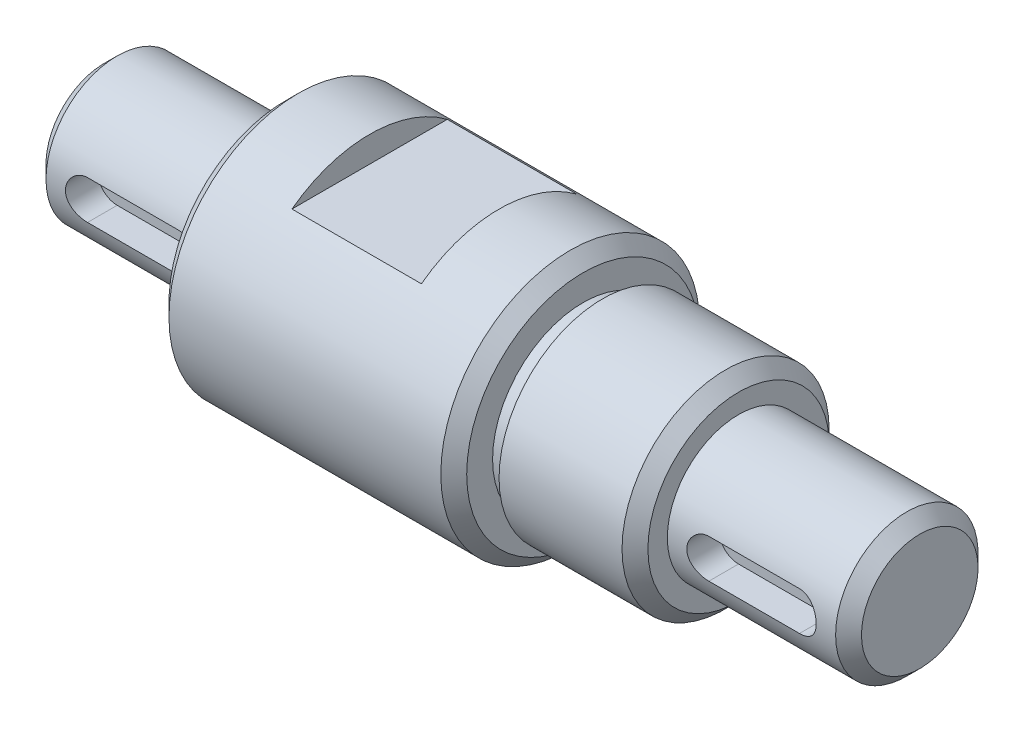
ISO-10303-21;
HEADER;
FILE_DESCRIPTION(('STEP AP214'),'2;1');
FILE_NAME('part.step','',(''),(''),'','','');
FILE_SCHEMA(('AUTOMOTIVE_DESIGN { 1 0 10303 214 1 1 1 1 }'));
ENDSEC;
DATA;
#1=APPLICATION_CONTEXT('core data for automotive mechanical design processes');
#2=APPLICATION_PROTOCOL_DEFINITION('international standard','automotive_design',2000,#1);
#3=PRODUCT_CONTEXT('',#1,'mechanical');
#4=PRODUCT('Part','Part','',(#3));
#5=PRODUCT_RELATED_PRODUCT_CATEGORY('part','',(#4));
#6=PRODUCT_DEFINITION_FORMATION('','',#4);
#7=PRODUCT_DEFINITION_CONTEXT('part definition',#1,'design');
#8=PRODUCT_DEFINITION('design','',#6,#7);
#9=PRODUCT_DEFINITION_SHAPE('','',#8);
#10=(LENGTH_UNIT() NAMED_UNIT(*) SI_UNIT(.MILLI.,.METRE.));
#11=(NAMED_UNIT(*) PLANE_ANGLE_UNIT() SI_UNIT($,.RADIAN.));
#12=(NAMED_UNIT(*) SI_UNIT($,.STERADIAN.) SOLID_ANGLE_UNIT());
#13=UNCERTAINTY_MEASURE_WITH_UNIT(LENGTH_MEASURE(1.E-05),#10,'distance_accuracy_value','');
#14=(GEOMETRIC_REPRESENTATION_CONTEXT(3) GLOBAL_UNCERTAINTY_ASSIGNED_CONTEXT((#13)) GLOBAL_UNIT_ASSIGNED_CONTEXT((#10,
#11,#12)) REPRESENTATION_CONTEXT('',''));
#15=CARTESIAN_POINT('',(0.,0.,0.));
#16=DIRECTION('',(0.,0.,1.));
#17=DIRECTION('',(1.,0.,0.));
#18=AXIS2_PLACEMENT_3D('',#15,#16,#17);
#19=CARTESIAN_POINT('',(0.,0.,0.));
#20=DIRECTION('',(1.,0.,0.));
#21=DIRECTION('',(0.,0.,-1.));
#22=AXIS2_PLACEMENT_3D('',#19,#20,#21);
#23=PLANE('',#22);
#24=CARTESIAN_POINT('',(0.,0.,0.));
#25=DIRECTION('',(1.,0.,0.));
#26=DIRECTION('',(0.,0.,-1.));
#27=AXIS2_PLACEMENT_3D('',#24,#25,#26);
#28=CIRCLE('',#27,8.99999999999999);
#29=CARTESIAN_POINT('',(0.,0.,-8.99999999999999));
#30=VERTEX_POINT('',#29);
#31=EDGE_CURVE('E225',#30,#30,#28,.F.);
#32=ORIENTED_EDGE('',*,*,#31,.T.);
#33=EDGE_LOOP('',(#32));
#34=FACE_BOUND('',#33,.T.);
#35=ADVANCED_FACE('F44',(#34),#23,.F.);
#36=CARTESIAN_POINT('',(0.,0.,0.));
#37=DIRECTION('',(-1.,0.,0.));
#38=DIRECTION('',(0.,0.,1.));
#39=AXIS2_PLACEMENT_3D('',#36,#37,#38);
#40=CYLINDRICAL_SURFACE('',#39,11.);
#41=DIRECTION('',(-1.,0.,0.));
#42=VECTOR('',#41,1.);
#43=CARTESIAN_POINT('',(0.,3.,10.5830052442584));
#44=LINE('',#43,#42);
#45=CARTESIAN_POINT('',(8.,3.,10.5830052442584));
#46=VERTEX_POINT('',#45);
#47=CARTESIAN_POINT('',(22.,3.,10.5830052442584));
#48=VERTEX_POINT('',#47);
#49=EDGE_CURVE('E11',#46,#48,#44,.F.);
#50=ORIENTED_EDGE('',*,*,#49,.T.);
#51=CARTESIAN_POINT('',(22.,3.,10.5830052442584));
#52=CARTESIAN_POINT('',(22.0826938914098,3.00000989976809,10.5829949970026));
#53=CARTESIAN_POINT('',(22.165381704592,2.99658102723595,10.5839742471726));
#54=CARTESIAN_POINT('',(22.3301335662288,2.98292268314841,10.5878356752194));
#55=CARTESIAN_POINT('',(22.4121977316291,2.97269452008914,10.5907174869552));
#56=CARTESIAN_POINT('',(22.5749425121448,2.94554459027321,10.598299618142));
#57=CARTESIAN_POINT('',(22.6556257893863,2.9286377012691,10.6029958951229));
#58=CARTESIAN_POINT('',(22.8152032540543,2.88829120712689,10.6140571066224));
#59=CARTESIAN_POINT('',(22.8940974074084,2.8648514776895,10.6204220728906));
#60=CARTESIAN_POINT('',(23.127242907164,2.78500332821793,10.6417494872311));
#61=CARTESIAN_POINT('',(23.2781393948553,2.71903526586307,10.6589535681767));
#62=CARTESIAN_POINT('',(23.5667053417687,2.56365897700126,10.6973836998985));
#63=CARTESIAN_POINT('',(23.704370097104,2.47424245636572,10.7186111730805));
#64=CARTESIAN_POINT('',(23.9662097059785,2.27200424315806,10.7633148792344));
#65=CARTESIAN_POINT('',(24.0899918782437,2.15868225262837,10.7868322128172));
#66=CARTESIAN_POINT('',(24.3170514389053,1.91292298422355,10.8331129950831));
#67=CARTESIAN_POINT('',(24.4203254772933,1.78048258944453,10.8558763200935));
#68=CARTESIAN_POINT('',(24.6050989067465,1.49749198480952,10.8985459264206));
#69=CARTESIAN_POINT('',(24.686203079821,1.34667477161624,10.9183977479742));
#70=CARTESIAN_POINT('',(24.8217484137797,1.03291980522387,10.9525311229674));
#71=CARTESIAN_POINT('',(24.8761955211319,0.869984764533408,10.9668139185607));
#72=CARTESIAN_POINT('',(24.9556017349027,0.540744675896731,10.9879090070619));
#73=CARTESIAN_POINT('',(24.9812343263694,0.374613167612547,10.9948916417093));
#74=CARTESIAN_POINT('',(25.004404664847,0.0402673813620307,11.0011960589752));
#75=CARTESIAN_POINT('',(25.0019467161783,-0.127946573564687,11.0005190152883));
#76=CARTESIAN_POINT('',(24.9694751241847,-0.456980924404248,10.9917041066205));
#77=CARTESIAN_POINT('',(24.9401899732267,-0.617879308918078,10.9837634920705));
#78=CARTESIAN_POINT('',(24.8560747841412,-0.932383527853136,10.9615477415639));
#79=CARTESIAN_POINT('',(24.8012435083153,-1.08598900853898,10.9472722986892));
#80=CARTESIAN_POINT('',(24.667045133193,-1.38338788045076,10.9137016176963));
#81=CARTESIAN_POINT('',(24.5874317537613,-1.52706425574145,10.8943563157114));
#82=CARTESIAN_POINT('',(24.4061201300935,-1.79926098198643,10.8527253375081));
#83=CARTESIAN_POINT('',(24.3044178271878,-1.92777854091953,10.830439121215));
#84=CARTESIAN_POINT('',(24.0779767649162,-2.17034844112028,10.7844948742978));
#85=CARTESIAN_POINT('',(23.952605446131,-2.2838069302889,10.760815765188));
#86=CARTESIAN_POINT('',(23.6843376191299,-2.48826234185506,10.7153886222241));
#87=CARTESIAN_POINT('',(23.5414362475461,-2.57925300980782,10.6936411271564));
#88=CARTESIAN_POINT('',(23.240805187246,-2.73667910615421,10.6544469945807));
#89=CARTESIAN_POINT('',(23.0829757572429,-2.80293223890785,10.6370325899538));
#90=CARTESIAN_POINT('',(22.7579129054731,-2.9076832432578,10.6088816209578));
#91=CARTESIAN_POINT('',(22.590694057725,-2.94622291362359,10.598135003286));
#92=CARTESIAN_POINT('',(22.3516455601334,-2.98015870664206,10.588613232355));
#93=CARTESIAN_POINT('',(22.2814835402763,-2.98759962141261,10.5865140551644));
#94=CARTESIAN_POINT('',(22.1408924467597,-2.99751512863222,10.58371035186));
#95=CARTESIAN_POINT('',(22.0704639649415,-2.99999749605757,10.5830036423878));
#96=CARTESIAN_POINT('',(22.,-3.,10.5830052442584));
#97=B_SPLINE_CURVE_WITH_KNOTS('',3,(#51,#52,#53,#54,#55,#56,#57,#58,#59,#60,#61,#62,#63,#64,#65,
#66,#67,#68,#69,#70,#71,#72,#73,#74,#75,#76,#77,#78,#79,#80,#81,#82,#83,#84,#85,#86,#87,#88,#89,
#90,#91,#92,#93,#94,#95,#96),.UNSPECIFIED.,.F.,.F.,(4,2,2,2,2,2,2,2,2,2,2,2,2,2,2,2,2,2,2,2,2,2,
4),(0.,0.247994395628692,0.49594107954412,0.743338515979064,0.990740659926203,1.48499724217183,
1.97942888795731,2.48547083856628,2.99159538337128,3.50622794981868,4.02074566333957,
4.52296979924471,5.02511698025348,5.51402000992994,6.00294672920887,6.49689640600088,
6.99093691914144,7.50077286033218,8.01075056671344,8.52441550873707,9.03730408243457,
9.24891043373582,9.46018472611218),.UNSPECIFIED.);
#98=CARTESIAN_POINT('',(22.,-3.,10.5830052442584));
#99=VERTEX_POINT('',#98);
#100=EDGE_CURVE('E557',#48,#99,#97,.T.);
#101=ORIENTED_EDGE('',*,*,#100,.T.);
#102=DIRECTION('',(-1.,0.,0.));
#103=VECTOR('',#102,1.);
#104=CARTESIAN_POINT('',(0.,-3.,10.5830052442584));
#105=LINE('',#104,#103);
#106=CARTESIAN_POINT('',(8.,-3.,10.5830052442584));
#107=VERTEX_POINT('',#106);
#108=EDGE_CURVE('E53',#99,#107,#105,.T.);
#109=ORIENTED_EDGE('',*,*,#108,.T.);
#110=CARTESIAN_POINT('',(8.,-3.,10.5830052442584));
#111=CARTESIAN_POINT('',(7.91730610859018,-3.00000989976809,10.5829949970026));
#112=CARTESIAN_POINT('',(7.83461829540796,-2.99658102723595,10.5839742471726));
#113=CARTESIAN_POINT('',(7.66986643377117,-2.98292268314841,10.5878356752194));
#114=CARTESIAN_POINT('',(7.58780226837092,-2.97269452008914,10.5907174869552));
#115=CARTESIAN_POINT('',(7.42505748785523,-2.94554459027321,10.598299618142));
#116=CARTESIAN_POINT('',(7.34437421061366,-2.9286377012691,10.6029958951229));
#117=CARTESIAN_POINT('',(7.18479674594573,-2.88829120712689,10.6140571066224));
#118=CARTESIAN_POINT('',(7.10590259259161,-2.8648514776895,10.6204220728906));
#119=CARTESIAN_POINT('',(6.87275709283599,-2.78500332821793,10.6417494872311));
#120=CARTESIAN_POINT('',(6.72186060514474,-2.71903526586307,10.6589535681767));
#121=CARTESIAN_POINT('',(6.43329465823131,-2.56365897700125,10.6973836998985));
#122=CARTESIAN_POINT('',(6.29562990289596,-2.47424245636571,10.7186111730805));
#123=CARTESIAN_POINT('',(6.03379029402149,-2.27200424315806,10.7633148792344));
#124=CARTESIAN_POINT('',(5.91000812175632,-2.15868225262836,10.7868322128172));
#125=CARTESIAN_POINT('',(5.68294856109473,-1.91292298422354,10.8331129950831));
#126=CARTESIAN_POINT('',(5.57967452270675,-1.78048258944452,10.8558763200935));
#127=CARTESIAN_POINT('',(5.39490109325355,-1.49749198480951,10.8985459264206));
#128=CARTESIAN_POINT('',(5.31379692017903,-1.34667477161623,10.9183977479742));
#129=CARTESIAN_POINT('',(5.17825158622032,-1.03291980522386,10.9525311229674));
#130=CARTESIAN_POINT('',(5.1238044788681,-0.869984764533403,10.9668139185607));
#131=CARTESIAN_POINT('',(5.0443982650973,-0.540744675896726,10.9879090070619));
#132=CARTESIAN_POINT('',(5.01876567363063,-0.374613167612541,10.9948916417093));
#133=CARTESIAN_POINT('',(4.99559533515301,-0.0402673813620246,11.0011960589752));
#134=CARTESIAN_POINT('',(4.99805328382166,0.127946573564692,11.0005190152883));
#135=CARTESIAN_POINT('',(5.03052487581529,0.456980924404254,10.9917041066205));
#136=CARTESIAN_POINT('',(5.05981002677334,0.617879308918084,10.9837634920705));
#137=CARTESIAN_POINT('',(5.14392521585875,0.932383527853142,10.9615477415639));
#138=CARTESIAN_POINT('',(5.19875649168473,1.08598900853898,10.9472722986892));
#139=CARTESIAN_POINT('',(5.33295486680702,1.38338788045077,10.9137016176963));
#140=CARTESIAN_POINT('',(5.41256824623875,1.52706425574145,10.8943563157114));
#141=CARTESIAN_POINT('',(5.59387986990652,1.79926098198643,10.8527253375081));
#142=CARTESIAN_POINT('',(5.69558217281222,1.92777854091953,10.830439121215));
#143=CARTESIAN_POINT('',(5.92202323508377,2.17034844112028,10.7844948742978));
#144=CARTESIAN_POINT('',(6.04739455386901,2.2838069302889,10.760815765188));
#145=CARTESIAN_POINT('',(6.31566238087013,2.48826234185506,10.7153886222241));
#146=CARTESIAN_POINT('',(6.45856375245395,2.57925300980782,10.6936411271563));
#147=CARTESIAN_POINT('',(6.75919481275404,2.73667910615422,10.6544469945807));
#148=CARTESIAN_POINT('',(6.91702424275707,2.80293223890785,10.6370325899538));
#149=CARTESIAN_POINT('',(7.24208709452695,2.9076832432578,10.6088816209578));
#150=CARTESIAN_POINT('',(7.40930594227505,2.94622291362359,10.598135003286));
#151=CARTESIAN_POINT('',(7.64835443986662,2.98015870664206,10.588613232355));
#152=CARTESIAN_POINT('',(7.71851645972366,2.98759962141261,10.5865140551644));
#153=CARTESIAN_POINT('',(7.85910755324026,2.99751512863222,10.58371035186));
#154=CARTESIAN_POINT('',(7.92953603505847,2.99999749605757,10.5830036423878));
#155=CARTESIAN_POINT('',(8.,3.,10.5830052442584));
#156=B_SPLINE_CURVE_WITH_KNOTS('',3,(#110,#111,#112,#113,#114,#115,#116,#117,#118,#119,#120,
#121,#122,#123,#124,#125,#126,#127,#128,#129,#130,#131,#132,#133,#134,#135,#136,#137,#138,#139,
#140,#141,#142,#143,#144,#145,#146,#147,#148,#149,#150,#151,#152,#153,#154,#155),.UNSPECIFIED.,
.F.,.F.,(4,2,2,2,2,2,2,2,2,2,2,2,2,2,2,2,2,2,2,2,2,2,4),(0.,0.247994395628695,0.495941079544124,
0.743338515979066,0.990740659926206,1.48499724217183,1.97942888795731,2.48547083856629,
2.99159538337129,3.50622794981869,4.02074566333957,4.52296979924472,5.02511698025349,
5.51402000992994,6.00294672920887,6.49689640600088,6.99093691914145,7.50077286033219,
8.01075056671345,8.52441550873707,9.03730408243458,9.24891043373582,9.46018472611218),.UNSPECIFIED.);
#157=EDGE_CURVE('E64',#107,#46,#156,.T.);
#158=ORIENTED_EDGE('',*,*,#157,.T.);
#159=EDGE_LOOP('',(#50,#101,#109,#158));
#160=FACE_BOUND('',#159,.T.);
#161=CARTESIAN_POINT('',(2.00000000000003,0.,0.));
#162=DIRECTION('',(1.,0.,0.));
#163=DIRECTION('',(0.,0.,-1.));
#164=AXIS2_PLACEMENT_3D('',#161,#162,#163);
#165=CIRCLE('',#164,11.);
#166=CARTESIAN_POINT('',(2.00000000000003,0.,-11.));
#167=VERTEX_POINT('',#166);
#168=EDGE_CURVE('E223',#167,#167,#165,.T.);
#169=ORIENTED_EDGE('',*,*,#168,.T.);
#170=EDGE_LOOP('',(#169));
#171=FACE_BOUND('',#170,.T.);
#172=CARTESIAN_POINT('',(28.,0.,0.));
#173=DIRECTION('',(-1.,0.,0.));
#174=DIRECTION('',(0.,0.,1.));
#175=AXIS2_PLACEMENT_3D('',#172,#173,#174);
#176=CIRCLE('',#175,11.);
#177=CARTESIAN_POINT('',(28.,0.,11.));
#178=VERTEX_POINT('',#177);
#179=EDGE_CURVE('E195',#178,#178,#176,.T.);
#180=ORIENTED_EDGE('',*,*,#179,.T.);
#181=EDGE_LOOP('',(#180));
#182=FACE_BOUND('',#181,.T.);
#183=ADVANCED_FACE('F301',(#160,#171,#182),#40,.T.);
#184=CARTESIAN_POINT('',(28.,11.,0.));
#185=DIRECTION('',(1.,0.,0.));
#186=DIRECTION('',(0.,0.,-1.));
#187=AXIS2_PLACEMENT_3D('',#184,#185,#186);
#188=PLANE('',#187);
#189=CARTESIAN_POINT('',(28.,0.,0.));
#190=DIRECTION('',(1.,0.,0.));
#191=DIRECTION('',(0.,0.,-1.));
#192=AXIS2_PLACEMENT_3D('',#189,#190,#191);
#193=CIRCLE('',#192,18.);
#194=CARTESIAN_POINT('',(28.,0.,-18.));
#195=VERTEX_POINT('',#194);
#196=EDGE_CURVE('E218',#195,#195,#193,.F.);
#197=ORIENTED_EDGE('',*,*,#196,.T.);
#198=EDGE_LOOP('',(#197));
#199=FACE_BOUND('',#198,.T.);
#200=ORIENTED_EDGE('',*,*,#179,.F.);
#201=EDGE_LOOP('',(#200));
#202=FACE_BOUND('',#201,.T.);
#203=ADVANCED_FACE('F310',(#199,#202),#188,.F.);
#204=CARTESIAN_POINT('',(0.,0.,0.));
#205=DIRECTION('',(-1.,0.,0.));
#206=DIRECTION('',(0.,0.,1.));
#207=AXIS2_PLACEMENT_3D('',#204,#205,#206);
#208=CYLINDRICAL_SURFACE('',#207,20.);
#209=CARTESIAN_POINT('',(61.,0.,0.));
#210=DIRECTION('',(1.,0.,0.));
#211=DIRECTION('',(0.,0.,-1.));
#212=AXIS2_PLACEMENT_3D('',#209,#210,#211);
#213=CIRCLE('',#212,20.);
#214=CARTESIAN_POINT('',(61.,16.,-12.));
#215=VERTEX_POINT('',#214);
#216=CARTESIAN_POINT('',(61.,16.,12.));
#217=VERTEX_POINT('',#216);
#218=EDGE_CURVE('E231',#215,#217,#213,.T.);
#219=ORIENTED_EDGE('',*,*,#218,.T.);
#220=DIRECTION('',(-1.,0.,0.));
#221=VECTOR('',#220,1.);
#222=CARTESIAN_POINT('',(0.,16.,12.));
#223=LINE('',#222,#221);
#224=CARTESIAN_POINT('',(41.,16.,12.));
#225=VERTEX_POINT('',#224);
#226=EDGE_CURVE('E240',#217,#225,#223,.T.);
#227=ORIENTED_EDGE('',*,*,#226,.T.);
#228=CARTESIAN_POINT('',(41.,0.,0.));
#229=DIRECTION('',(-1.,0.,0.));
#230=DIRECTION('',(0.,0.,1.));
#231=AXIS2_PLACEMENT_3D('',#228,#229,#230);
#232=CIRCLE('',#231,20.);
#233=CARTESIAN_POINT('',(41.,16.,-12.));
#234=VERTEX_POINT('',#233);
#235=EDGE_CURVE('E233',#225,#234,#232,.T.);
#236=ORIENTED_EDGE('',*,*,#235,.T.);
#237=DIRECTION('',(-1.,0.,0.));
#238=VECTOR('',#237,1.);
#239=CARTESIAN_POINT('',(0.,16.,-12.));
#240=LINE('',#239,#238);
#241=EDGE_CURVE('E230',#234,#215,#240,.F.);
#242=ORIENTED_EDGE('',*,*,#241,.T.);
#243=EDGE_LOOP('',(#219,#227,#236,#242));
#244=FACE_BOUND('',#243,.T.);
#245=CARTESIAN_POINT('',(72.,0.,0.));
#246=DIRECTION('',(-1.,0.,0.));
#247=DIRECTION('',(0.,0.,1.));
#248=AXIS2_PLACEMENT_3D('',#245,#246,#247);
#249=CIRCLE('',#248,20.);
#250=CARTESIAN_POINT('',(72.,0.,20.));
#251=VERTEX_POINT('',#250);
#252=EDGE_CURVE('E213',#251,#251,#249,.T.);
#253=ORIENTED_EDGE('',*,*,#252,.T.);
#254=EDGE_LOOP('',(#253));
#255=FACE_BOUND('',#254,.T.);
#256=CARTESIAN_POINT('',(30.,0.,0.));
#257=DIRECTION('',(1.,0.,0.));
#258=DIRECTION('',(0.,0.,-1.));
#259=AXIS2_PLACEMENT_3D('',#256,#257,#258);
#260=CIRCLE('',#259,20.);
#261=CARTESIAN_POINT('',(30.,0.,-20.));
#262=VERTEX_POINT('',#261);
#263=EDGE_CURVE('E209',#262,#262,#260,.T.);
#264=ORIENTED_EDGE('',*,*,#263,.T.);
#265=EDGE_LOOP('',(#264));
#266=FACE_BOUND('',#265,.T.);
#267=ADVANCED_FACE('F345',(#244,#255,#266),#208,.T.);
#268=CARTESIAN_POINT('',(74.,20.,0.));
#269=DIRECTION('',(-1.,0.,0.));
#270=DIRECTION('',(0.,0.,1.));
#271=AXIS2_PLACEMENT_3D('',#268,#269,#270);
#272=PLANE('',#271);
#273=CARTESIAN_POINT('',(74.,0.,0.));
#274=DIRECTION('',(-1.,0.,0.));
#275=DIRECTION('',(0.,0.,1.));
#276=AXIS2_PLACEMENT_3D('',#273,#274,#275);
#277=CIRCLE('',#276,18.);
#278=CARTESIAN_POINT('',(74.,0.,18.));
#279=VERTEX_POINT('',#278);
#280=EDGE_CURVE('E216',#279,#279,#277,.F.);
#281=ORIENTED_EDGE('',*,*,#280,.T.);
#282=EDGE_LOOP('',(#281));
#283=FACE_BOUND('',#282,.T.);
#284=CARTESIAN_POINT('',(74.,0.,0.));
#285=DIRECTION('',(-1.,0.,0.));
#286=DIRECTION('',(0.,0.,1.));
#287=AXIS2_PLACEMENT_3D('',#284,#285,#286);
#288=CIRCLE('',#287,14.);
#289=CARTESIAN_POINT('',(74.,0.,14.));
#290=VERTEX_POINT('',#289);
#291=EDGE_CURVE('E192',#290,#290,#288,.T.);
#292=ORIENTED_EDGE('',*,*,#291,.T.);
#293=EDGE_LOOP('',(#292));
#294=FACE_BOUND('',#293,.T.);
#295=ADVANCED_FACE('F351',(#283,#294),#272,.F.);
#296=CARTESIAN_POINT('',(0.,0.,0.));
#297=DIRECTION('',(-1.,0.,0.));
#298=DIRECTION('',(0.,0.,1.));
#299=AXIS2_PLACEMENT_3D('',#296,#297,#298);
#300=CYLINDRICAL_SURFACE('',#299,14.);
#301=ORIENTED_EDGE('',*,*,#291,.F.);
#302=EDGE_LOOP('',(#301));
#303=FACE_BOUND('',#302,.T.);
#304=CARTESIAN_POINT('',(77.,0.,0.));
#305=DIRECTION('',(-1.,0.,0.));
#306=DIRECTION('',(0.,0.,1.));
#307=AXIS2_PLACEMENT_3D('',#304,#305,#306);
#308=CIRCLE('',#307,14.);
#309=CARTESIAN_POINT('',(77.,0.,14.));
#310=VERTEX_POINT('',#309);
#311=EDGE_CURVE('E188',#310,#310,#308,.T.);
#312=ORIENTED_EDGE('',*,*,#311,.T.);
#313=EDGE_LOOP('',(#312));
#314=FACE_BOUND('',#313,.T.);
#315=ADVANCED_FACE('F357',(#303,#314),#300,.T.);
#316=CARTESIAN_POINT('',(77.,14.,0.));
#317=DIRECTION('',(1.,0.,0.));
#318=DIRECTION('',(0.,0.,-1.));
#319=AXIS2_PLACEMENT_3D('',#316,#317,#318);
#320=PLANE('',#319);
#321=ORIENTED_EDGE('',*,*,#311,.F.);
#322=EDGE_LOOP('',(#321));
#323=FACE_BOUND('',#322,.T.);
#324=CARTESIAN_POINT('',(77.,0.,0.));
#325=DIRECTION('',(-1.,0.,0.));
#326=DIRECTION('',(0.,0.,1.));
#327=AXIS2_PLACEMENT_3D('',#324,#325,#326);
#328=CIRCLE('',#327,16.);
#329=CARTESIAN_POINT('',(77.,0.,16.));
#330=VERTEX_POINT('',#329);
#331=EDGE_CURVE('E189',#330,#330,#328,.T.);
#332=ORIENTED_EDGE('',*,*,#331,.T.);
#333=EDGE_LOOP('',(#332));
#334=FACE_BOUND('',#333,.T.);
#335=ADVANCED_FACE('F363',(#323,#334),#320,.F.);
#336=CARTESIAN_POINT('',(0.,0.,0.));
#337=DIRECTION('',(-1.,0.,0.));
#338=DIRECTION('',(0.,0.,1.));
#339=AXIS2_PLACEMENT_3D('',#336,#337,#338);
#340=CYLINDRICAL_SURFACE('',#339,16.);
#341=CARTESIAN_POINT('',(96.,0.,0.));
#342=DIRECTION('',(-1.,0.,0.));
#343=DIRECTION('',(0.,0.,1.));
#344=AXIS2_PLACEMENT_3D('',#341,#342,#343);
#345=CIRCLE('',#344,16.);
#346=CARTESIAN_POINT('',(96.,0.,16.));
#347=VERTEX_POINT('',#346);
#348=EDGE_CURVE('E204',#347,#347,#345,.T.);
#349=ORIENTED_EDGE('',*,*,#348,.T.);
#350=EDGE_LOOP('',(#349));
#351=FACE_BOUND('',#350,.T.);
#352=ORIENTED_EDGE('',*,*,#331,.F.);
#353=EDGE_LOOP('',(#352));
#354=FACE_BOUND('',#353,.T.);
#355=ADVANCED_FACE('F365',(#351,#354),#340,.T.);
#356=CARTESIAN_POINT('',(98.,16.,0.));
#357=DIRECTION('',(-1.,0.,0.));
#358=DIRECTION('',(0.,0.,1.));
#359=AXIS2_PLACEMENT_3D('',#356,#357,#358);
#360=PLANE('',#359);
#361=CARTESIAN_POINT('',(98.,0.,0.));
#362=DIRECTION('',(-1.,0.,0.));
#363=DIRECTION('',(0.,0.,1.));
#364=AXIS2_PLACEMENT_3D('',#361,#362,#363);
#365=CIRCLE('',#364,14.);
#366=CARTESIAN_POINT('',(98.,0.,14.));
#367=VERTEX_POINT('',#366);
#368=EDGE_CURVE('E210',#367,#367,#365,.F.);
#369=ORIENTED_EDGE('',*,*,#368,.T.);
#370=EDGE_LOOP('',(#369));
#371=FACE_BOUND('',#370,.T.);
#372=CARTESIAN_POINT('',(98.,0.,0.));
#373=DIRECTION('',(-1.,0.,0.));
#374=DIRECTION('',(0.,0.,1.));
#375=AXIS2_PLACEMENT_3D('',#372,#373,#374);
#376=CIRCLE('',#375,11.);
#377=CARTESIAN_POINT('',(98.,0.,11.));
#378=VERTEX_POINT('',#377);
#379=EDGE_CURVE('E182',#378,#378,#376,.T.);
#380=ORIENTED_EDGE('',*,*,#379,.T.);
#381=EDGE_LOOP('',(#380));
#382=FACE_BOUND('',#381,.T.);
#383=ADVANCED_FACE('F300',(#371,#382),#360,.F.);
#384=CARTESIAN_POINT('',(0.,0.,0.));
#385=DIRECTION('',(-1.,0.,0.));
#386=DIRECTION('',(0.,0.,1.));
#387=AXIS2_PLACEMENT_3D('',#384,#385,#386);
#388=CYLINDRICAL_SURFACE('',#387,11.);
#389=DIRECTION('',(-1.,0.,0.));
#390=VECTOR('',#389,1.);
#391=CARTESIAN_POINT('',(0.,3.,10.5830052442584));
#392=LINE('',#391,#390);
#393=CARTESIAN_POINT('',(104.,3.,10.5830052442584));
#394=VERTEX_POINT('',#393);
#395=CARTESIAN_POINT('',(118.,3.,10.5830052442584));
#396=VERTEX_POINT('',#395);
#397=EDGE_CURVE('E566',#394,#396,#392,.F.);
#398=ORIENTED_EDGE('',*,*,#397,.T.);
#399=CARTESIAN_POINT('',(118.,3.,10.5830052442584));
#400=CARTESIAN_POINT('',(118.08269389141,3.00000989976809,10.5829949970026));
#401=CARTESIAN_POINT('',(118.165381704592,2.99658102723595,10.5839742471726));
#402=CARTESIAN_POINT('',(118.330133566229,2.98292268314841,10.5878356752194));
#403=CARTESIAN_POINT('',(118.412197731629,2.97269452008914,10.5907174869552));
#404=CARTESIAN_POINT('',(118.574942512145,2.94554459027321,10.598299618142));
#405=CARTESIAN_POINT('',(118.655625789386,2.9286377012691,10.6029958951229));
#406=CARTESIAN_POINT('',(118.815203254054,2.88829120712689,10.6140571066224));
#407=CARTESIAN_POINT('',(118.894097407408,2.8648514776895,10.6204220728906));
#408=CARTESIAN_POINT('',(119.127242907164,2.78500332821793,10.6417494872311));
#409=CARTESIAN_POINT('',(119.278139394855,2.71903526586307,10.6589535681767));
#410=CARTESIAN_POINT('',(119.566705341769,2.56365897700126,10.6973836998985));
#411=CARTESIAN_POINT('',(119.704370097104,2.47424245636572,10.7186111730805));
#412=CARTESIAN_POINT('',(119.966209705978,2.27200424315806,10.7633148792344));
#413=CARTESIAN_POINT('',(120.089991878244,2.15868225262836,10.7868322128172));
#414=CARTESIAN_POINT('',(120.317051438905,1.91292298422355,10.8331129950831));
#415=CARTESIAN_POINT('',(120.420325477293,1.78048258944453,10.8558763200935));
#416=CARTESIAN_POINT('',(120.605098906746,1.49749198480952,10.8985459264206));
#417=CARTESIAN_POINT('',(120.686203079821,1.34667477161624,10.9183977479742));
#418=CARTESIAN_POINT('',(120.82174841378,1.03291980522387,10.9525311229674));
#419=CARTESIAN_POINT('',(120.876195521132,0.869984764533407,10.9668139185607));
#420=CARTESIAN_POINT('',(120.955601734903,0.540744675896728,10.9879090070619));
#421=CARTESIAN_POINT('',(120.981234326369,0.374613167612542,10.9948916417093));
#422=CARTESIAN_POINT('',(121.004404664847,0.0402673813620226,11.0011960589752));
#423=CARTESIAN_POINT('',(121.001946716178,-0.127946573564695,11.0005190152883));
#424=CARTESIAN_POINT('',(120.969475124185,-0.456980924404257,10.9917041066205));
#425=CARTESIAN_POINT('',(120.940189973227,-0.617879308918086,10.9837634920705));
#426=CARTESIAN_POINT('',(120.856074784141,-0.932383527853143,10.9615477415639));
#427=CARTESIAN_POINT('',(120.801243508315,-1.08598900853898,10.9472722986892));
#428=CARTESIAN_POINT('',(120.667045133193,-1.38338788045077,10.9137016176963));
#429=CARTESIAN_POINT('',(120.587431753761,-1.52706425574144,10.8943563157114));
#430=CARTESIAN_POINT('',(120.406120130093,-1.79926098198643,10.8527253375081));
#431=CARTESIAN_POINT('',(120.304417827188,-1.92777854091953,10.830439121215));
#432=CARTESIAN_POINT('',(120.077976764916,-2.17034844112028,10.7844948742978));
#433=CARTESIAN_POINT('',(119.952605446131,-2.28380693028889,10.760815765188));
#434=CARTESIAN_POINT('',(119.68433761913,-2.48826234185506,10.7153886222241));
#435=CARTESIAN_POINT('',(119.541436247546,-2.57925300980782,10.6936411271564));
#436=CARTESIAN_POINT('',(119.240805187246,-2.73667910615422,10.6544469945807));
#437=CARTESIAN_POINT('',(119.082975757243,-2.80293223890785,10.6370325899538));
#438=CARTESIAN_POINT('',(118.757912905473,-2.9076832432578,10.6088816209578));
#439=CARTESIAN_POINT('',(118.590694057725,-2.94622291362359,10.598135003286));
#440=CARTESIAN_POINT('',(118.351645560133,-2.98015870664206,10.588613232355));
#441=CARTESIAN_POINT('',(118.281483540276,-2.98759962141261,10.5865140551644));
#442=CARTESIAN_POINT('',(118.14089244676,-2.99751512863222,10.58371035186));
#443=CARTESIAN_POINT('',(118.070463964942,-2.99999749605757,10.5830036423878));
#444=CARTESIAN_POINT('',(118.,-3.,10.5830052442584));
#445=B_SPLINE_CURVE_WITH_KNOTS('',3,(#399,#400,#401,#402,#403,#404,#405,#406,#407,#408,#409,
#410,#411,#412,#413,#414,#415,#416,#417,#418,#419,#420,#421,#422,#423,#424,#425,#426,#427,#428,
#429,#430,#431,#432,#433,#434,#435,#436,#437,#438,#439,#440,#441,#442,#443,#444),.UNSPECIFIED.,
.F.,.F.,(4,2,2,2,2,2,2,2,2,2,2,2,2,2,2,2,2,2,2,2,2,2,4),(0.,0.247994395628699,0.495941079544131,
0.743338515979078,0.99074065992621,1.48499724217182,1.97942888795732,2.48547083856629,
2.99159538337129,3.50622794981869,4.02074566333957,4.52296979924472,5.02511698025349,
5.51402000992995,6.00294672920888,6.49689640600088,6.99093691914144,7.50077286033218,
8.01075056671345,8.52441550873707,9.03730408243458,9.24891043373583,9.46018472611218),.UNSPECIFIED.);
#446=CARTESIAN_POINT('',(118.,-3.,10.5830052442584));
#447=VERTEX_POINT('',#446);
#448=EDGE_CURVE('E238',#396,#447,#445,.T.);
#449=ORIENTED_EDGE('',*,*,#448,.T.);
#450=DIRECTION('',(-1.,0.,0.));
#451=VECTOR('',#450,1.);
#452=CARTESIAN_POINT('',(0.,-3.,10.5830052442584));
#453=LINE('',#452,#451);
#454=CARTESIAN_POINT('',(104.,-3.,10.5830052442584));
#455=VERTEX_POINT('',#454);
#456=EDGE_CURVE('E580',#447,#455,#453,.T.);
#457=ORIENTED_EDGE('',*,*,#456,.T.);
#458=CARTESIAN_POINT('',(104.,-3.,10.5830052442584));
#459=CARTESIAN_POINT('',(103.91730610859,-3.00000989976809,10.5829949970026));
#460=CARTESIAN_POINT('',(103.834618295408,-2.99658102723595,10.5839742471726));
#461=CARTESIAN_POINT('',(103.669866433771,-2.98292268314841,10.5878356752194));
#462=CARTESIAN_POINT('',(103.587802268371,-2.97269452008914,10.5907174869552));
#463=CARTESIAN_POINT('',(103.425057487855,-2.94554459027321,10.598299618142));
#464=CARTESIAN_POINT('',(103.344374210614,-2.9286377012691,10.6029958951229));
#465=CARTESIAN_POINT('',(103.184796745946,-2.88829120712689,10.6140571066224));
#466=CARTESIAN_POINT('',(103.105902592592,-2.8648514776895,10.6204220728906));
#467=CARTESIAN_POINT('',(102.872757092836,-2.78500332821793,10.6417494872311));
#468=CARTESIAN_POINT('',(102.721860605145,-2.71903526586307,10.6589535681767));
#469=CARTESIAN_POINT('',(102.433294658231,-2.56365897700126,10.6973836998985));
#470=CARTESIAN_POINT('',(102.295629902896,-2.47424245636572,10.7186111730805));
#471=CARTESIAN_POINT('',(102.033790294022,-2.27200424315806,10.7633148792344));
#472=CARTESIAN_POINT('',(101.910008121756,-2.15868225262836,10.7868322128172));
#473=CARTESIAN_POINT('',(101.682948561095,-1.91292298422355,10.8331129950831));
#474=CARTESIAN_POINT('',(101.579674522707,-1.78048258944453,10.8558763200935));
#475=CARTESIAN_POINT('',(101.394901093254,-1.49749198480952,10.8985459264206));
#476=CARTESIAN_POINT('',(101.313796920179,-1.34667477161624,10.9183977479742));
#477=CARTESIAN_POINT('',(101.17825158622,-1.03291980522387,10.9525311229674));
#478=CARTESIAN_POINT('',(101.123804478868,-0.869984764533407,10.9668139185607));
#479=CARTESIAN_POINT('',(101.044398265097,-0.540744675896728,10.9879090070619));
#480=CARTESIAN_POINT('',(101.018765673631,-0.374613167612542,10.9948916417093));
#481=CARTESIAN_POINT('',(100.995595335153,-0.0402673813620226,11.0011960589752));
#482=CARTESIAN_POINT('',(100.998053283822,0.127946573564695,11.0005190152883));
#483=CARTESIAN_POINT('',(101.030524875815,0.456980924404257,10.9917041066205));
#484=CARTESIAN_POINT('',(101.059810026773,0.617879308918086,10.9837634920705));
#485=CARTESIAN_POINT('',(101.143925215859,0.932383527853143,10.9615477415639));
#486=CARTESIAN_POINT('',(101.198756491685,1.08598900853898,10.9472722986892));
#487=CARTESIAN_POINT('',(101.332954866807,1.38338788045077,10.9137016176963));
#488=CARTESIAN_POINT('',(101.412568246239,1.52706425574145,10.8943563157114));
#489=CARTESIAN_POINT('',(101.593879869907,1.79926098198643,10.8527253375081));
#490=CARTESIAN_POINT('',(101.695582172812,1.92777854091953,10.830439121215));
#491=CARTESIAN_POINT('',(101.922023235084,2.17034844112028,10.7844948742978));
#492=CARTESIAN_POINT('',(102.047394553869,2.2838069302889,10.760815765188));
#493=CARTESIAN_POINT('',(102.31566238087,2.48826234185506,10.7153886222241));
#494=CARTESIAN_POINT('',(102.458563752454,2.57925300980782,10.6936411271564));
#495=CARTESIAN_POINT('',(102.759194812754,2.73667910615422,10.6544469945807));
#496=CARTESIAN_POINT('',(102.917024242757,2.80293223890785,10.6370325899538));
#497=CARTESIAN_POINT('',(103.242087094527,2.9076832432578,10.6088816209578));
#498=CARTESIAN_POINT('',(103.409305942275,2.94622291362359,10.598135003286));
#499=CARTESIAN_POINT('',(103.648354439867,2.98015870664206,10.588613232355));
#500=CARTESIAN_POINT('',(103.718516459724,2.98759962141261,10.5865140551644));
#501=CARTESIAN_POINT('',(103.85910755324,2.99751512863222,10.58371035186));
#502=CARTESIAN_POINT('',(103.929536035058,2.99999749605757,10.5830036423878));
#503=CARTESIAN_POINT('',(104.,3.,10.5830052442584));
#504=B_SPLINE_CURVE_WITH_KNOTS('',3,(#458,#459,#460,#461,#462,#463,#464,#465,#466,#467,#468,
#469,#470,#471,#472,#473,#474,#475,#476,#477,#478,#479,#480,#481,#482,#483,#484,#485,#486,#487,
#488,#489,#490,#491,#492,#493,#494,#495,#496,#497,#498,#499,#500,#501,#502,#503),.UNSPECIFIED.,
.F.,.F.,(4,2,2,2,2,2,2,2,2,2,2,2,2,2,2,2,2,2,2,2,2,2,4),(0.,0.247994395628713,0.495941079544131,
0.743338515979078,0.99074065992621,1.48499724217182,1.97942888795731,2.48547083856629,
2.99159538337129,3.50622794981869,4.02074566333957,4.52296979924472,5.02511698025349,
5.51402000992995,6.00294672920888,6.49689640600088,6.99093691914144,7.50077286033219,
8.01075056671345,8.52441550873708,9.03730408243458,9.24891043373584,9.46018472611219),.UNSPECIFIED.);
#505=EDGE_CURVE('E68',#455,#394,#504,.T.);
#506=ORIENTED_EDGE('',*,*,#505,.T.);
#507=EDGE_LOOP('',(#398,#449,#457,#506));
#508=FACE_BOUND('',#507,.T.);
#509=CARTESIAN_POINT('',(124.,0.,0.));
#510=DIRECTION('',(-1.,0.,0.));
#511=DIRECTION('',(0.,0.,1.));
#512=AXIS2_PLACEMENT_3D('',#509,#510,#511);
#513=CIRCLE('',#512,11.);
#514=CARTESIAN_POINT('',(124.,0.,11.));
#515=VERTEX_POINT('',#514);
#516=EDGE_CURVE('E196',#515,#515,#513,.T.);
#517=ORIENTED_EDGE('',*,*,#516,.T.);
#518=EDGE_LOOP('',(#517));
#519=FACE_BOUND('',#518,.T.);
#520=ORIENTED_EDGE('',*,*,#379,.F.);
#521=EDGE_LOOP('',(#520));
#522=FACE_BOUND('',#521,.T.);
#523=ADVANCED_FACE('F254',(#508,#519,#522),#388,.T.);
#524=CARTESIAN_POINT('',(126.,11.,0.));
#525=DIRECTION('',(-1.,0.,0.));
#526=DIRECTION('',(0.,0.,1.));
#527=AXIS2_PLACEMENT_3D('',#524,#525,#526);
#528=PLANE('',#527);
#529=CARTESIAN_POINT('',(126.,0.,0.));
#530=DIRECTION('',(-1.,0.,0.));
#531=DIRECTION('',(0.,0.,1.));
#532=AXIS2_PLACEMENT_3D('',#529,#530,#531);
#533=CIRCLE('',#532,9.00000000000002);
#534=CARTESIAN_POINT('',(126.,0.,9.00000000000002));
#535=VERTEX_POINT('',#534);
#536=EDGE_CURVE('E203',#535,#535,#533,.F.);
#537=ORIENTED_EDGE('',*,*,#536,.T.);
#538=EDGE_LOOP('',(#537));
#539=FACE_BOUND('',#538,.T.);
#540=ADVANCED_FACE('F286',(#539),#528,.F.);
#541=CARTESIAN_POINT('',(124.,0.,0.));
#542=DIRECTION('',(-1.,0.,0.));
#543=DIRECTION('',(0.,0.,1.));
#544=AXIS2_PLACEMENT_3D('',#541,#542,#543);
#545=CONICAL_SURFACE('',#544,11.,0.785398163397446);
#546=ORIENTED_EDGE('',*,*,#536,.F.);
#547=EDGE_LOOP('',(#546));
#548=FACE_BOUND('',#547,.T.);
#549=ORIENTED_EDGE('',*,*,#516,.F.);
#550=EDGE_LOOP('',(#549));
#551=FACE_BOUND('',#550,.T.);
#552=ADVANCED_FACE('F289',(#548,#551),#545,.T.);
#553=CARTESIAN_POINT('',(96.,0.,0.));
#554=DIRECTION('',(-1.,0.,0.));
#555=DIRECTION('',(0.,0.,1.));
#556=AXIS2_PLACEMENT_3D('',#553,#554,#555);
#557=CONICAL_SURFACE('',#556,16.,0.785398163397455);
#558=ORIENTED_EDGE('',*,*,#368,.F.);
#559=EDGE_LOOP('',(#558));
#560=FACE_BOUND('',#559,.T.);
#561=ORIENTED_EDGE('',*,*,#348,.F.);
#562=EDGE_LOOP('',(#561));
#563=FACE_BOUND('',#562,.T.);
#564=ADVANCED_FACE('F294',(#560,#563),#557,.T.);
#565=CARTESIAN_POINT('',(72.,0.,0.));
#566=DIRECTION('',(-1.,0.,0.));
#567=DIRECTION('',(0.,0.,1.));
#568=AXIS2_PLACEMENT_3D('',#565,#566,#567);
#569=CONICAL_SURFACE('',#568,20.,0.785398163397454);
#570=ORIENTED_EDGE('',*,*,#280,.F.);
#571=EDGE_LOOP('',(#570));
#572=FACE_BOUND('',#571,.T.);
#573=ORIENTED_EDGE('',*,*,#252,.F.);
#574=EDGE_LOOP('',(#573));
#575=FACE_BOUND('',#574,.T.);
#576=ADVANCED_FACE('F322',(#572,#575),#569,.T.);
#577=CARTESIAN_POINT('',(28.,0.,0.));
#578=DIRECTION('',(1.,0.,0.));
#579=DIRECTION('',(0.,0.,-1.));
#580=AXIS2_PLACEMENT_3D('',#577,#578,#579);
#581=CONICAL_SURFACE('',#580,18.,0.785398163397445);
#582=ORIENTED_EDGE('',*,*,#263,.F.);
#583=EDGE_LOOP('',(#582));
#584=FACE_BOUND('',#583,.T.);
#585=ORIENTED_EDGE('',*,*,#196,.F.);
#586=EDGE_LOOP('',(#585));
#587=FACE_BOUND('',#586,.T.);
#588=ADVANCED_FACE('F329',(#584,#587),#581,.T.);
#589=CARTESIAN_POINT('',(0.,0.,0.));
#590=DIRECTION('',(1.,0.,0.));
#591=DIRECTION('',(0.,0.,-1.));
#592=AXIS2_PLACEMENT_3D('',#589,#590,#591);
#593=CONICAL_SURFACE('',#592,8.99999999999999,0.785398163397443);
#594=ORIENTED_EDGE('',*,*,#168,.F.);
#595=EDGE_LOOP('',(#594));
#596=FACE_BOUND('',#595,.T.);
#597=ORIENTED_EDGE('',*,*,#31,.F.);
#598=EDGE_LOOP('',(#597));
#599=FACE_BOUND('',#598,.T.);
#600=ADVANCED_FACE('F48',(#596,#599),#593,.T.);
#601=CARTESIAN_POINT('',(41.,22.,-20.));
#602=DIRECTION('',(-1.,0.,0.));
#603=DIRECTION('',(0.,0.,1.));
#604=AXIS2_PLACEMENT_3D('',#601,#602,#603);
#605=PLANE('',#604);
#606=DIRECTION('',(0.,0.,1.));
#607=VECTOR('',#606,1.);
#608=CARTESIAN_POINT('',(41.,16.,-20.));
#609=LINE('',#608,#607);
#610=EDGE_CURVE('E154',#234,#225,#609,.T.);
#611=ORIENTED_EDGE('',*,*,#610,.F.);
#612=ORIENTED_EDGE('',*,*,#235,.F.);
#613=EDGE_LOOP('',(#611,#612));
#614=FACE_BOUND('',#613,.T.);
#615=ADVANCED_FACE('F276',(#614),#605,.F.);
#616=CARTESIAN_POINT('',(61.,16.,-20.));
#617=DIRECTION('',(1.,0.,0.));
#618=DIRECTION('',(0.,0.,-1.));
#619=AXIS2_PLACEMENT_3D('',#616,#617,#618);
#620=PLANE('',#619);
#621=DIRECTION('',(0.,0.,1.));
#622=VECTOR('',#621,1.);
#623=CARTESIAN_POINT('',(61.,16.,-20.));
#624=LINE('',#623,#622);
#625=EDGE_CURVE('E179',#215,#217,#624,.T.);
#626=ORIENTED_EDGE('',*,*,#625,.T.);
#627=ORIENTED_EDGE('',*,*,#218,.F.);
#628=EDGE_LOOP('',(#626,#627));
#629=FACE_BOUND('',#628,.T.);
#630=ADVANCED_FACE('F274',(#629),#620,.F.);
#631=CARTESIAN_POINT('',(41.,16.,-20.));
#632=DIRECTION('',(0.,-1.,0.));
#633=DIRECTION('',(0.,0.,-1.));
#634=AXIS2_PLACEMENT_3D('',#631,#632,#633);
#635=PLANE('',#634);
#636=ORIENTED_EDGE('',*,*,#625,.F.);
#637=ORIENTED_EDGE('',*,*,#241,.F.);
#638=ORIENTED_EDGE('',*,*,#610,.T.);
#639=ORIENTED_EDGE('',*,*,#226,.F.);
#640=EDGE_LOOP('',(#636,#637,#638,#639));
#641=FACE_BOUND('',#640,.T.);
#642=ADVANCED_FACE('F279',(#641),#635,.F.);
#643=CARTESIAN_POINT('',(104.,0.,6.));
#644=DIRECTION('',(0.,0.,1.));
#645=DIRECTION('',(1.,0.,0.));
#646=AXIS2_PLACEMENT_3D('',#643,#644,#645);
#647=CYLINDRICAL_SURFACE('',#646,3.);
#648=DIRECTION('',(0.,0.,1.));
#649=VECTOR('',#648,1.);
#650=CARTESIAN_POINT('',(104.,-3.,6.));
#651=LINE('',#650,#649);
#652=CARTESIAN_POINT('',(104.,-3.,6.));
#653=VERTEX_POINT('',#652);
#654=EDGE_CURVE('E159',#653,#455,#651,.T.);
#655=ORIENTED_EDGE('',*,*,#654,.F.);
#656=CARTESIAN_POINT('',(104.,0.,6.));
#657=DIRECTION('',(0.,0.,1.));
#658=DIRECTION('',(1.,0.,0.));
#659=AXIS2_PLACEMENT_3D('',#656,#657,#658);
#660=CIRCLE('',#659,3.);
#661=CARTESIAN_POINT('',(104.,3.,6.));
#662=VERTEX_POINT('',#661);
#663=EDGE_CURVE('E144',#662,#653,#660,.T.);
#664=ORIENTED_EDGE('',*,*,#663,.F.);
#665=DIRECTION('',(0.,0.,1.));
#666=VECTOR('',#665,1.);
#667=CARTESIAN_POINT('',(104.,3.,6.));
#668=LINE('',#667,#666);
#669=EDGE_CURVE('E166',#662,#394,#668,.T.);
#670=ORIENTED_EDGE('',*,*,#669,.T.);
#671=ORIENTED_EDGE('',*,*,#505,.F.);
#672=EDGE_LOOP('',(#655,#664,#670,#671));
#673=FACE_BOUND('',#672,.T.);
#674=ADVANCED_FACE('F267',(#673),#647,.F.);
#675=CARTESIAN_POINT('',(104.,3.,6.));
#676=DIRECTION('',(0.,1.,0.));
#677=DIRECTION('',(0.,0.,1.));
#678=AXIS2_PLACEMENT_3D('',#675,#676,#677);
#679=PLANE('',#678);
#680=ORIENTED_EDGE('',*,*,#669,.F.);
#681=DIRECTION('',(-1.,0.,0.));
#682=VECTOR('',#681,1.);
#683=CARTESIAN_POINT('',(104.,3.,6.));
#684=LINE('',#683,#682);
#685=CARTESIAN_POINT('',(118.,3.,6.));
#686=VERTEX_POINT('',#685);
#687=EDGE_CURVE('E165',#686,#662,#684,.T.);
#688=ORIENTED_EDGE('',*,*,#687,.F.);
#689=DIRECTION('',(0.,0.,1.));
#690=VECTOR('',#689,1.);
#691=CARTESIAN_POINT('',(118.,3.,6.));
#692=LINE('',#691,#690);
#693=EDGE_CURVE('E167',#686,#396,#692,.T.);
#694=ORIENTED_EDGE('',*,*,#693,.T.);
#695=ORIENTED_EDGE('',*,*,#397,.F.);
#696=EDGE_LOOP('',(#680,#688,#694,#695));
#697=FACE_BOUND('',#696,.T.);
#698=ADVANCED_FACE('F264',(#697),#679,.F.);
#699=CARTESIAN_POINT('',(118.,0.,6.));
#700=DIRECTION('',(0.,0.,1.));
#701=DIRECTION('',(1.,0.,0.));
#702=AXIS2_PLACEMENT_3D('',#699,#700,#701);
#703=CYLINDRICAL_SURFACE('',#702,3.);
#704=ORIENTED_EDGE('',*,*,#693,.F.);
#705=CARTESIAN_POINT('',(118.,0.,6.));
#706=DIRECTION('',(0.,0.,1.));
#707=DIRECTION('',(1.,0.,0.));
#708=AXIS2_PLACEMENT_3D('',#705,#706,#707);
#709=CIRCLE('',#708,3.);
#710=CARTESIAN_POINT('',(118.,-3.,6.));
#711=VERTEX_POINT('',#710);
#712=EDGE_CURVE('E175',#711,#686,#709,.T.);
#713=ORIENTED_EDGE('',*,*,#712,.F.);
#714=DIRECTION('',(0.,0.,1.));
#715=VECTOR('',#714,1.);
#716=CARTESIAN_POINT('',(118.,-3.,6.));
#717=LINE('',#716,#715);
#718=EDGE_CURVE('E162',#711,#447,#717,.T.);
#719=ORIENTED_EDGE('',*,*,#718,.T.);
#720=ORIENTED_EDGE('',*,*,#448,.F.);
#721=EDGE_LOOP('',(#704,#713,#719,#720));
#722=FACE_BOUND('',#721,.T.);
#723=ADVANCED_FACE('F259',(#722),#703,.F.);
#724=CARTESIAN_POINT('',(118.,-3.,6.));
#725=DIRECTION('',(0.,-1.,0.));
#726=DIRECTION('',(0.,0.,-1.));
#727=AXIS2_PLACEMENT_3D('',#724,#725,#726);
#728=PLANE('',#727);
#729=ORIENTED_EDGE('',*,*,#718,.F.);
#730=DIRECTION('',(1.,0.,0.));
#731=VECTOR('',#730,1.);
#732=CARTESIAN_POINT('',(118.,-3.,6.));
#733=LINE('',#732,#731);
#734=EDGE_CURVE('E146',#653,#711,#733,.T.);
#735=ORIENTED_EDGE('',*,*,#734,.F.);
#736=ORIENTED_EDGE('',*,*,#654,.T.);
#737=ORIENTED_EDGE('',*,*,#456,.F.);
#738=EDGE_LOOP('',(#729,#735,#736,#737));
#739=FACE_BOUND('',#738,.T.);
#740=ADVANCED_FACE('F262',(#739),#728,.F.);
#741=CARTESIAN_POINT('',(104.,0.,6.));
#742=DIRECTION('',(0.,0.,1.));
#743=DIRECTION('',(1.,0.,0.));
#744=AXIS2_PLACEMENT_3D('',#741,#742,#743);
#745=PLANE('',#744);
#746=ORIENTED_EDGE('',*,*,#663,.T.);
#747=ORIENTED_EDGE('',*,*,#734,.T.);
#748=ORIENTED_EDGE('',*,*,#712,.T.);
#749=ORIENTED_EDGE('',*,*,#687,.T.);
#750=EDGE_LOOP('',(#746,#747,#748,#749));
#751=FACE_BOUND('',#750,.T.);
#752=ADVANCED_FACE('F271',(#751),#745,.T.);
#753=CARTESIAN_POINT('',(8.,0.,6.));
#754=DIRECTION('',(0.,0.,1.));
#755=DIRECTION('',(1.,0.,0.));
#756=AXIS2_PLACEMENT_3D('',#753,#754,#755);
#757=CYLINDRICAL_SURFACE('',#756,3.);
#758=DIRECTION('',(0.,0.,1.));
#759=VECTOR('',#758,1.);
#760=CARTESIAN_POINT('',(8.,-3.,6.));
#761=LINE('',#760,#759);
#762=CARTESIAN_POINT('',(8.,-3.,6.));
#763=VERTEX_POINT('',#762);
#764=EDGE_CURVE('E124',#763,#107,#761,.T.);
#765=ORIENTED_EDGE('',*,*,#764,.F.);
#766=CARTESIAN_POINT('',(8.,0.,6.));
#767=DIRECTION('',(0.,0.,1.));
#768=DIRECTION('',(1.,0.,0.));
#769=AXIS2_PLACEMENT_3D('',#766,#767,#768);
#770=CIRCLE('',#769,3.);
#771=CARTESIAN_POINT('',(8.,3.,6.));
#772=VERTEX_POINT('',#771);
#773=EDGE_CURVE('E130',#772,#763,#770,.T.);
#774=ORIENTED_EDGE('',*,*,#773,.F.);
#775=DIRECTION('',(0.,0.,1.));
#776=VECTOR('',#775,1.);
#777=CARTESIAN_POINT('',(8.,3.,6.));
#778=LINE('',#777,#776);
#779=EDGE_CURVE('E153',#772,#46,#778,.T.);
#780=ORIENTED_EDGE('',*,*,#779,.T.);
#781=ORIENTED_EDGE('',*,*,#157,.F.);
#782=EDGE_LOOP('',(#765,#774,#780,#781));
#783=FACE_BOUND('',#782,.T.);
#784=ADVANCED_FACE('F125',(#783),#757,.F.);
#785=CARTESIAN_POINT('',(8.,3.,6.));
#786=DIRECTION('',(0.,1.,0.));
#787=DIRECTION('',(0.,0.,1.));
#788=AXIS2_PLACEMENT_3D('',#785,#786,#787);
#789=PLANE('',#788);
#790=ORIENTED_EDGE('',*,*,#779,.F.);
#791=DIRECTION('',(-1.,0.,0.));
#792=VECTOR('',#791,1.);
#793=CARTESIAN_POINT('',(8.,3.,6.));
#794=LINE('',#793,#792);
#795=CARTESIAN_POINT('',(22.,3.,6.));
#796=VERTEX_POINT('',#795);
#797=EDGE_CURVE('E131',#796,#772,#794,.T.);
#798=ORIENTED_EDGE('',*,*,#797,.F.);
#799=DIRECTION('',(0.,0.,1.));
#800=VECTOR('',#799,1.);
#801=CARTESIAN_POINT('',(22.,3.,6.));
#802=LINE('',#801,#800);
#803=EDGE_CURVE('E156',#796,#48,#802,.T.);
#804=ORIENTED_EDGE('',*,*,#803,.T.);
#805=ORIENTED_EDGE('',*,*,#49,.F.);
#806=EDGE_LOOP('',(#790,#798,#804,#805));
#807=FACE_BOUND('',#806,.T.);
#808=ADVANCED_FACE('F492',(#807),#789,.F.);
#809=CARTESIAN_POINT('',(22.,0.,6.));
#810=DIRECTION('',(0.,0.,1.));
#811=DIRECTION('',(1.,0.,0.));
#812=AXIS2_PLACEMENT_3D('',#809,#810,#811);
#813=CYLINDRICAL_SURFACE('',#812,3.);
#814=ORIENTED_EDGE('',*,*,#803,.F.);
#815=CARTESIAN_POINT('',(22.,0.,6.));
#816=DIRECTION('',(0.,0.,1.));
#817=DIRECTION('',(1.,0.,0.));
#818=AXIS2_PLACEMENT_3D('',#815,#816,#817);
#819=CIRCLE('',#818,3.);
#820=CARTESIAN_POINT('',(22.,-3.,6.));
#821=VERTEX_POINT('',#820);
#822=EDGE_CURVE('E143',#821,#796,#819,.T.);
#823=ORIENTED_EDGE('',*,*,#822,.F.);
#824=DIRECTION('',(0.,0.,1.));
#825=VECTOR('',#824,1.);
#826=CARTESIAN_POINT('',(22.,-3.,6.));
#827=LINE('',#826,#825);
#828=EDGE_CURVE('E134',#821,#99,#827,.T.);
#829=ORIENTED_EDGE('',*,*,#828,.T.);
#830=ORIENTED_EDGE('',*,*,#100,.F.);
#831=EDGE_LOOP('',(#814,#823,#829,#830));
#832=FACE_BOUND('',#831,.T.);
#833=ADVANCED_FACE('F504',(#832),#813,.F.);
#834=CARTESIAN_POINT('',(22.,-3.,6.));
#835=DIRECTION('',(0.,-1.,0.));
#836=DIRECTION('',(0.,0.,-1.));
#837=AXIS2_PLACEMENT_3D('',#834,#835,#836);
#838=PLANE('',#837);
#839=ORIENTED_EDGE('',*,*,#828,.F.);
#840=DIRECTION('',(1.,0.,0.));
#841=VECTOR('',#840,1.);
#842=CARTESIAN_POINT('',(22.,-3.,6.));
#843=LINE('',#842,#841);
#844=EDGE_CURVE('E132',#763,#821,#843,.T.);
#845=ORIENTED_EDGE('',*,*,#844,.F.);
#846=ORIENTED_EDGE('',*,*,#764,.T.);
#847=ORIENTED_EDGE('',*,*,#108,.F.);
#848=EDGE_LOOP('',(#839,#845,#846,#847));
#849=FACE_BOUND('',#848,.T.);
#850=ADVANCED_FACE('F136',(#849),#838,.F.);
#851=CARTESIAN_POINT('',(8.,0.,6.));
#852=DIRECTION('',(0.,0.,1.));
#853=DIRECTION('',(1.,0.,0.));
#854=AXIS2_PLACEMENT_3D('',#851,#852,#853);
#855=PLANE('',#854);
#856=ORIENTED_EDGE('',*,*,#773,.T.);
#857=ORIENTED_EDGE('',*,*,#844,.T.);
#858=ORIENTED_EDGE('',*,*,#822,.T.);
#859=ORIENTED_EDGE('',*,*,#797,.T.);
#860=EDGE_LOOP('',(#856,#857,#858,#859));
#861=FACE_BOUND('',#860,.T.);
#862=ADVANCED_FACE('F141',(#861),#855,.T.);
#863=CLOSED_SHELL('',(#35,#183,#203,#267,#295,#315,#335,#355,#383,#523,#540,#552,#564,#576,#588,
#600,#615,#630,#642,#674,#698,#723,#740,#752,#784,#808,#833,#850,#862));
#864=MANIFOLD_SOLID_BREP('B2',#863);
#865=ADVANCED_BREP_SHAPE_REPRESENTATION('',(#18,#864),#14);
#866=SHAPE_DEFINITION_REPRESENTATION(#9,#865);
ENDSEC;
END-ISO-10303-21;
